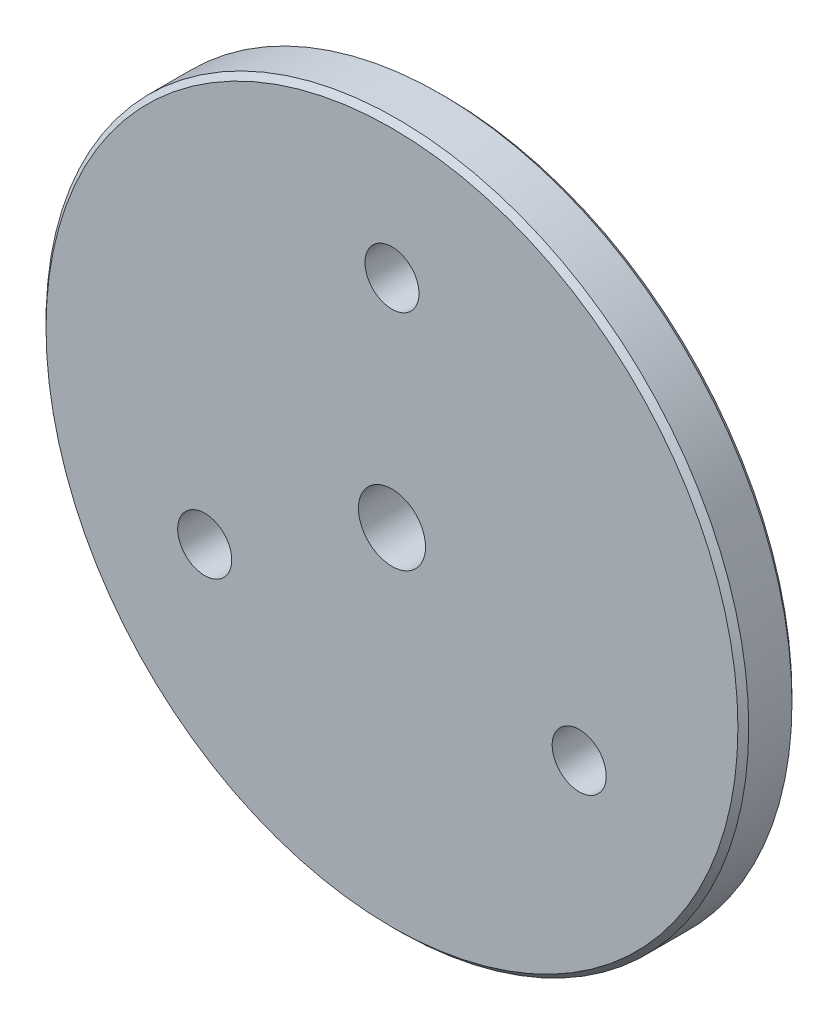
ISO-10303-21;
HEADER;
FILE_DESCRIPTION(('STEP AP214'),'2;1');
FILE_NAME('part.step','',(''),(''),'','','');
FILE_SCHEMA(('AUTOMOTIVE_DESIGN { 1 0 10303 214 1 1 1 1 }'));
ENDSEC;
DATA;
#1=APPLICATION_CONTEXT('core data for automotive mechanical design processes');
#2=APPLICATION_PROTOCOL_DEFINITION('international standard','automotive_design',2000,#1);
#3=PRODUCT_CONTEXT('',#1,'mechanical');
#4=PRODUCT('Part','Part','',(#3));
#5=PRODUCT_RELATED_PRODUCT_CATEGORY('part','',(#4));
#6=PRODUCT_DEFINITION_FORMATION('','',#4);
#7=PRODUCT_DEFINITION_CONTEXT('part definition',#1,'design');
#8=PRODUCT_DEFINITION('design','',#6,#7);
#9=PRODUCT_DEFINITION_SHAPE('','',#8);
#10=(LENGTH_UNIT() NAMED_UNIT(*) SI_UNIT(.MILLI.,.METRE.));
#11=(NAMED_UNIT(*) PLANE_ANGLE_UNIT() SI_UNIT($,.RADIAN.));
#12=(NAMED_UNIT(*) SI_UNIT($,.STERADIAN.) SOLID_ANGLE_UNIT());
#13=UNCERTAINTY_MEASURE_WITH_UNIT(LENGTH_MEASURE(1.E-05),#10,'distance_accuracy_value','');
#14=(GEOMETRIC_REPRESENTATION_CONTEXT(3) GLOBAL_UNCERTAINTY_ASSIGNED_CONTEXT((#13)) GLOBAL_UNIT_ASSIGNED_CONTEXT((#10,
#11,#12)) REPRESENTATION_CONTEXT('',''));
#15=CARTESIAN_POINT('',(0.,0.,0.));
#16=DIRECTION('',(0.,0.,1.));
#17=DIRECTION('',(1.,0.,0.));
#18=AXIS2_PLACEMENT_3D('',#15,#16,#17);
#19=CARTESIAN_POINT('',(0.,0.,5.));
#20=DIRECTION('',(0.,0.,1.));
#21=DIRECTION('',(1.,0.,0.));
#22=AXIS2_PLACEMENT_3D('',#19,#20,#21);
#23=PLANE('',#22);
#24=CARTESIAN_POINT('',(0.,0.,5.));
#25=DIRECTION('',(0.,0.,1.));
#26=DIRECTION('',(1.,0.,0.));
#27=AXIS2_PLACEMENT_3D('',#24,#25,#26);
#28=CIRCLE('',#27,32.);
#29=CARTESIAN_POINT('',(32.,0.,5.));
#30=VERTEX_POINT('',#29);
#31=EDGE_CURVE('E97',#30,#30,#28,.T.);
#32=ORIENTED_EDGE('',*,*,#31,.T.);
#33=EDGE_LOOP('',(#32));
#34=FACE_BOUND('',#33,.T.);
#35=CARTESIAN_POINT('',(0.,0.,5.));
#36=DIRECTION('',(0.,0.,1.));
#37=DIRECTION('',(1.,0.,0.));
#38=AXIS2_PLACEMENT_3D('',#35,#36,#37);
#39=CIRCLE('',#38,3.1);
#40=CARTESIAN_POINT('',(3.1,0.,5.));
#41=VERTEX_POINT('',#40);
#42=EDGE_CURVE('E120',#41,#41,#39,.T.);
#43=ORIENTED_EDGE('',*,*,#42,.F.);
#44=EDGE_LOOP('',(#43));
#45=FACE_BOUND('',#44,.T.);
#46=CARTESIAN_POINT('',(-17.3205080756887,-10.0000000000001,5.));
#47=DIRECTION('',(0.,0.,1.));
#48=DIRECTION('',(1.,0.,0.));
#49=AXIS2_PLACEMENT_3D('',#46,#47,#48);
#50=CIRCLE('',#49,2.5);
#51=CARTESIAN_POINT('',(-14.8205080756887,-10.0000000000001,5.));
#52=VERTEX_POINT('',#51);
#53=EDGE_CURVE('E128',#52,#52,#50,.T.);
#54=ORIENTED_EDGE('',*,*,#53,.F.);
#55=EDGE_LOOP('',(#54));
#56=FACE_BOUND('',#55,.T.);
#57=CARTESIAN_POINT('',(0.,20.,5.));
#58=DIRECTION('',(0.,0.,1.));
#59=DIRECTION('',(1.,0.,0.));
#60=AXIS2_PLACEMENT_3D('',#57,#58,#59);
#61=CIRCLE('',#60,2.5);
#62=CARTESIAN_POINT('',(2.5,20.,5.));
#63=VERTEX_POINT('',#62);
#64=EDGE_CURVE('E138',#63,#63,#61,.T.);
#65=ORIENTED_EDGE('',*,*,#64,.F.);
#66=EDGE_LOOP('',(#65));
#67=FACE_BOUND('',#66,.T.);
#68=CARTESIAN_POINT('',(17.3205080756887,-10.0000000000001,5.));
#69=DIRECTION('',(0.,0.,1.));
#70=DIRECTION('',(1.,0.,0.));
#71=AXIS2_PLACEMENT_3D('',#68,#69,#70);
#72=CIRCLE('',#71,2.5);
#73=CARTESIAN_POINT('',(19.8205080756887,-10.0000000000001,5.));
#74=VERTEX_POINT('',#73);
#75=EDGE_CURVE('E122',#74,#74,#72,.T.);
#76=ORIENTED_EDGE('',*,*,#75,.F.);
#77=EDGE_LOOP('',(#76));
#78=FACE_BOUND('',#77,.T.);
#79=ADVANCED_FACE('F41',(#34,#45,#56,#67,#78),#23,.T.);
#80=CARTESIAN_POINT('',(0.,0.,0.));
#81=DIRECTION('',(0.,0.,1.));
#82=DIRECTION('',(1.,0.,0.));
#83=AXIS2_PLACEMENT_3D('',#80,#81,#82);
#84=PLANE('',#83);
#85=CARTESIAN_POINT('',(0.,0.,0.));
#86=DIRECTION('',(0.,0.,1.));
#87=DIRECTION('',(1.,0.,0.));
#88=AXIS2_PLACEMENT_3D('',#85,#86,#87);
#89=CIRCLE('',#88,32.);
#90=CARTESIAN_POINT('',(32.,0.,0.));
#91=VERTEX_POINT('',#90);
#92=EDGE_CURVE('E106',#91,#91,#89,.F.);
#93=ORIENTED_EDGE('',*,*,#92,.T.);
#94=EDGE_LOOP('',(#93));
#95=FACE_BOUND('',#94,.T.);
#96=DIRECTION('',(-1.,0.,0.));
#97=VECTOR('',#96,1.);
#98=CARTESIAN_POINT('',(0.,6.5,0.));
#99=LINE('',#98,#97);
#100=CARTESIAN_POINT('',(8.24621125123538,6.5,0.));
#101=VERTEX_POINT('',#100);
#102=CARTESIAN_POINT('',(-8.24621125123539,6.5,0.));
#103=VERTEX_POINT('',#102);
#104=EDGE_CURVE('E109',#101,#103,#99,.T.);
#105=ORIENTED_EDGE('',*,*,#104,.T.);
#106=CARTESIAN_POINT('',(0.,0.,0.));
#107=DIRECTION('',(0.,0.,1.));
#108=DIRECTION('',(1.,0.,0.));
#109=AXIS2_PLACEMENT_3D('',#106,#107,#108);
#110=CIRCLE('',#109,10.5);
#111=EDGE_CURVE('E100',#103,#101,#110,.T.);
#112=ORIENTED_EDGE('',*,*,#111,.T.);
#113=EDGE_LOOP('',(#105,#112));
#114=FACE_BOUND('',#113,.T.);
#115=CARTESIAN_POINT('',(0.,20.,0.));
#116=DIRECTION('',(0.,0.,1.));
#117=DIRECTION('',(1.,0.,0.));
#118=AXIS2_PLACEMENT_3D('',#115,#116,#117);
#119=CIRCLE('',#118,2.5);
#120=CARTESIAN_POINT('',(2.5,20.,0.));
#121=VERTEX_POINT('',#120);
#122=EDGE_CURVE('E134',#121,#121,#119,.T.);
#123=ORIENTED_EDGE('',*,*,#122,.T.);
#124=EDGE_LOOP('',(#123));
#125=FACE_BOUND('',#124,.T.);
#126=CARTESIAN_POINT('',(-17.3205080756887,-10.0000000000001,0.));
#127=DIRECTION('',(0.,0.,1.));
#128=DIRECTION('',(1.,0.,0.));
#129=AXIS2_PLACEMENT_3D('',#126,#127,#128);
#130=CIRCLE('',#129,2.5);
#131=CARTESIAN_POINT('',(-14.8205080756887,-10.0000000000001,0.));
#132=VERTEX_POINT('',#131);
#133=EDGE_CURVE('E130',#132,#132,#130,.T.);
#134=ORIENTED_EDGE('',*,*,#133,.T.);
#135=EDGE_LOOP('',(#134));
#136=FACE_BOUND('',#135,.T.);
#137=CARTESIAN_POINT('',(17.3205080756887,-10.0000000000001,0.));
#138=DIRECTION('',(0.,0.,1.));
#139=DIRECTION('',(1.,0.,0.));
#140=AXIS2_PLACEMENT_3D('',#137,#138,#139);
#141=CIRCLE('',#140,2.5);
#142=CARTESIAN_POINT('',(19.8205080756887,-10.0000000000001,0.));
#143=VERTEX_POINT('',#142);
#144=EDGE_CURVE('E121',#143,#143,#141,.T.);
#145=ORIENTED_EDGE('',*,*,#144,.T.);
#146=EDGE_LOOP('',(#145));
#147=FACE_BOUND('',#146,.T.);
#148=ADVANCED_FACE('F193',(#95,#114,#125,#136,#147),#84,.F.);
#149=CARTESIAN_POINT('',(0.,0.,5.));
#150=DIRECTION('',(0.,0.,-1.));
#151=DIRECTION('',(-1.,0.,0.));
#152=AXIS2_PLACEMENT_3D('',#149,#150,#151);
#153=CYLINDRICAL_SURFACE('',#152,32.5);
#154=CARTESIAN_POINT('',(0.,0.,0.49999999999998));
#155=DIRECTION('',(0.,0.,1.));
#156=DIRECTION('',(1.,0.,0.));
#157=AXIS2_PLACEMENT_3D('',#154,#155,#156);
#158=CIRCLE('',#157,32.5);
#159=CARTESIAN_POINT('',(32.5,0.,0.49999999999998));
#160=VERTEX_POINT('',#159);
#161=EDGE_CURVE('E251',#160,#160,#158,.T.);
#162=ORIENTED_EDGE('',*,*,#161,.T.);
#163=EDGE_LOOP('',(#162));
#164=FACE_BOUND('',#163,.T.);
#165=CARTESIAN_POINT('',(0.,0.,4.5));
#166=DIRECTION('',(0.,0.,1.));
#167=DIRECTION('',(1.,0.,0.));
#168=AXIS2_PLACEMENT_3D('',#165,#166,#167);
#169=CIRCLE('',#168,32.5);
#170=CARTESIAN_POINT('',(32.5,0.,4.5));
#171=VERTEX_POINT('',#170);
#172=EDGE_CURVE('E255',#171,#171,#169,.F.);
#173=ORIENTED_EDGE('',*,*,#172,.T.);
#174=EDGE_LOOP('',(#173));
#175=FACE_BOUND('',#174,.T.);
#176=ADVANCED_FACE('F186',(#164,#175),#153,.T.);
#177=CARTESIAN_POINT('',(0.,20.,5.));
#178=DIRECTION('',(0.,0.,-1.));
#179=DIRECTION('',(-1.,0.,0.));
#180=AXIS2_PLACEMENT_3D('',#177,#178,#179);
#181=CYLINDRICAL_SURFACE('',#180,2.5);
#182=ORIENTED_EDGE('',*,*,#64,.T.);
#183=EDGE_LOOP('',(#182));
#184=FACE_BOUND('',#183,.T.);
#185=ORIENTED_EDGE('',*,*,#122,.F.);
#186=EDGE_LOOP('',(#185));
#187=FACE_BOUND('',#186,.T.);
#188=ADVANCED_FACE('F190',(#184,#187),#181,.F.);
#189=CARTESIAN_POINT('',(-17.3205080756887,-10.0000000000001,5.));
#190=DIRECTION('',(0.,0.,-1.));
#191=DIRECTION('',(-1.,0.,0.));
#192=AXIS2_PLACEMENT_3D('',#189,#190,#191);
#193=CYLINDRICAL_SURFACE('',#192,2.5);
#194=ORIENTED_EDGE('',*,*,#53,.T.);
#195=EDGE_LOOP('',(#194));
#196=FACE_BOUND('',#195,.T.);
#197=ORIENTED_EDGE('',*,*,#133,.F.);
#198=EDGE_LOOP('',(#197));
#199=FACE_BOUND('',#198,.T.);
#200=ADVANCED_FACE('F203',(#196,#199),#193,.F.);
#201=CARTESIAN_POINT('',(17.3205080756887,-10.0000000000001,5.));
#202=DIRECTION('',(0.,0.,-1.));
#203=DIRECTION('',(-1.,0.,0.));
#204=AXIS2_PLACEMENT_3D('',#201,#202,#203);
#205=CYLINDRICAL_SURFACE('',#204,2.5);
#206=ORIENTED_EDGE('',*,*,#75,.T.);
#207=EDGE_LOOP('',(#206));
#208=FACE_BOUND('',#207,.T.);
#209=ORIENTED_EDGE('',*,*,#144,.F.);
#210=EDGE_LOOP('',(#209));
#211=FACE_BOUND('',#210,.T.);
#212=ADVANCED_FACE('F202',(#208,#211),#205,.F.);
#213=CARTESIAN_POINT('',(0.,0.,-14.5));
#214=DIRECTION('',(0.,0.,1.));
#215=DIRECTION('',(1.,0.,0.));
#216=AXIS2_PLACEMENT_3D('',#213,#214,#215);
#217=CYLINDRICAL_SURFACE('',#216,10.);
#218=DIRECTION('',(0.,0.,-1.));
#219=VECTOR('',#218,1.);
#220=CARTESIAN_POINT('',(7.59934207678533,6.5,0.));
#221=LINE('',#220,#219);
#222=CARTESIAN_POINT('',(7.59934207678533,6.5,-0.500000000000056));
#223=VERTEX_POINT('',#222);
#224=CARTESIAN_POINT('',(7.59934207678533,6.5,-14.));
#225=VERTEX_POINT('',#224);
#226=EDGE_CURVE('E104',#223,#225,#221,.T.);
#227=ORIENTED_EDGE('',*,*,#226,.F.);
#228=CARTESIAN_POINT('',(0.,0.,-0.500000000000056));
#229=DIRECTION('',(0.,0.,1.));
#230=DIRECTION('',(1.,0.,0.));
#231=AXIS2_PLACEMENT_3D('',#228,#229,#230);
#232=CIRCLE('',#231,10.);
#233=CARTESIAN_POINT('',(-7.59934207678533,6.5,-0.500000000000056));
#234=VERTEX_POINT('',#233);
#235=EDGE_CURVE('E92',#223,#234,#232,.F.);
#236=ORIENTED_EDGE('',*,*,#235,.T.);
#237=DIRECTION('',(0.,0.,-1.));
#238=VECTOR('',#237,1.);
#239=CARTESIAN_POINT('',(-7.59934207678533,6.5,0.));
#240=LINE('',#239,#238);
#241=CARTESIAN_POINT('',(-7.59934207678533,6.5,-14.));
#242=VERTEX_POINT('',#241);
#243=EDGE_CURVE('E102',#234,#242,#240,.T.);
#244=ORIENTED_EDGE('',*,*,#243,.T.);
#245=CARTESIAN_POINT('',(0.,0.,-14.));
#246=DIRECTION('',(0.,0.,-1.));
#247=DIRECTION('',(-1.,0.,0.));
#248=AXIS2_PLACEMENT_3D('',#245,#246,#247);
#249=CIRCLE('',#248,10.);
#250=EDGE_CURVE('E110',#242,#225,#249,.F.);
#251=ORIENTED_EDGE('',*,*,#250,.T.);
#252=EDGE_LOOP('',(#227,#236,#244,#251));
#253=FACE_BOUND('',#252,.T.);
#254=ADVANCED_FACE('F103',(#253),#217,.T.);
#255=CARTESIAN_POINT('',(0.,0.,-14.5));
#256=DIRECTION('',(0.,0.,-1.));
#257=DIRECTION('',(-1.,0.,0.));
#258=AXIS2_PLACEMENT_3D('',#255,#256,#257);
#259=PLANE('',#258);
#260=DIRECTION('',(-1.,0.,0.));
#261=VECTOR('',#260,1.);
#262=CARTESIAN_POINT('',(0.,6.5,-14.5));
#263=LINE('',#262,#261);
#264=CARTESIAN_POINT('',(6.92820323027555,6.5,-14.5));
#265=VERTEX_POINT('',#264);
#266=CARTESIAN_POINT('',(-6.92820323027555,6.5,-14.5));
#267=VERTEX_POINT('',#266);
#268=EDGE_CURVE('E111',#265,#267,#263,.T.);
#269=ORIENTED_EDGE('',*,*,#268,.F.);
#270=CARTESIAN_POINT('',(0.,0.,-14.5));
#271=DIRECTION('',(0.,0.,-1.));
#272=DIRECTION('',(-1.,0.,0.));
#273=AXIS2_PLACEMENT_3D('',#270,#271,#272);
#274=CIRCLE('',#273,9.50000000000003);
#275=EDGE_CURVE('E144',#265,#267,#274,.T.);
#276=ORIENTED_EDGE('',*,*,#275,.T.);
#277=EDGE_LOOP('',(#269,#276));
#278=FACE_BOUND('',#277,.T.);
#279=CARTESIAN_POINT('',(0.,0.,-14.5));
#280=DIRECTION('',(0.,0.,-1.));
#281=DIRECTION('',(-1.,0.,0.));
#282=AXIS2_PLACEMENT_3D('',#279,#280,#281);
#283=CIRCLE('',#282,3.1);
#284=CARTESIAN_POINT('',(-3.1,0.,-14.5));
#285=VERTEX_POINT('',#284);
#286=EDGE_CURVE('E115',#285,#285,#283,.T.);
#287=ORIENTED_EDGE('',*,*,#286,.F.);
#288=EDGE_LOOP('',(#287));
#289=FACE_BOUND('',#288,.T.);
#290=ADVANCED_FACE('F211',(#278,#289),#259,.T.);
#291=CARTESIAN_POINT('',(0.,0.,10.));
#292=DIRECTION('',(0.,0.,-1.));
#293=DIRECTION('',(-1.,0.,0.));
#294=AXIS2_PLACEMENT_3D('',#291,#292,#293);
#295=CYLINDRICAL_SURFACE('',#294,3.1);
#296=CARTESIAN_POINT('',(-1.5,2.71293199325011,-7.25));
#297=CARTESIAN_POINT('',(-1.49999492059757,2.71293810602707,-7.17145338095106));
#298=CARTESIAN_POINT('',(-1.49378977985908,2.71639437877482,-7.09279890208662));
#299=CARTESIAN_POINT('',(-1.46927137742174,2.72972979584767,-6.93787319036452));
#300=CARTESIAN_POINT('',(-1.45093105142698,2.73962329586937,-6.86160768457514));
#301=CARTESIAN_POINT('',(-1.4030976209863,2.76442252776009,-6.71398954425589));
#302=CARTESIAN_POINT('',(-1.37366086619922,2.7793028937549,-6.64261420542806));
#303=CARTESIAN_POINT('',(-1.30464150179683,2.81236022577533,-6.50583245638499));
#304=CARTESIAN_POINT('',(-1.2650589136927,2.83053718481149,-6.44042603351486));
#305=CARTESIAN_POINT('',(-1.17329480013247,2.86985264094388,-6.31187111011291));
#306=CARTESIAN_POINT('',(-1.12037798569234,2.89111140167801,-6.24928399126661));
#307=CARTESIAN_POINT('',(-1.00497971934906,2.93322157526014,-6.13344072464569));
#308=CARTESIAN_POINT('',(-0.94249377317567,2.95407279148337,-6.08018898669397));
#309=CARTESIAN_POINT('',(-0.804980520744671,2.99457001608098,-5.98129528716694));
#310=CARTESIAN_POINT('',(-0.729415143076343,3.01406059193925,-5.93633192135187));
#311=CARTESIAN_POINT('',(-0.570673893121411,3.04809814226509,-5.86000972137905));
#312=CARTESIAN_POINT('',(-0.487502560865868,3.06264804171259,-5.82864283477935));
#313=CARTESIAN_POINT('',(-0.321847709467146,3.08430127904169,-5.78258786508132));
#314=CARTESIAN_POINT('',(-0.239695127397447,3.09184014117435,-5.76691875227797));
#315=CARTESIAN_POINT('',(-0.0736068203923179,3.10023882355099,-5.7494857824594));
#316=CARTESIAN_POINT('',(0.0103278765621595,3.10110239470556,-5.74771411632615));
#317=CARTESIAN_POINT('',(0.170273249700909,3.09627020423456,-5.75771943077071));
#318=CARTESIAN_POINT('',(0.246371834339656,3.09110371985573,-5.76840308096274));
#319=CARTESIAN_POINT('',(0.395538468369623,3.07557700513506,-5.80107628892171));
#320=CARTESIAN_POINT('',(0.46860629156116,3.06521638788366,-5.82306668892852));
#321=CARTESIAN_POINT('',(0.61095110434779,3.04007288157933,-5.87790542061429));
#322=CARTESIAN_POINT('',(0.68015806569427,3.02522825824131,-5.91090604729296));
#323=CARTESIAN_POINT('',(0.812225689942344,2.99247817620383,-5.98663535937203));
#324=CARTESIAN_POINT('',(0.875084030725964,2.97457160394644,-6.02936758580624));
#325=CARTESIAN_POINT('',(0.998700620360538,2.9355013363418,-6.12777575195723));
#326=CARTESIAN_POINT('',(1.05876095216352,2.91418954377451,-6.18427039936896));
#327=CARTESIAN_POINT('',(1.16891768527134,2.87178037530514,-6.30638943634393));
#328=CARTESIAN_POINT('',(1.21900726107665,2.8506831556003,-6.37202002806386));
#329=CARTESIAN_POINT('',(1.31055794759544,2.80982104768052,-6.51511878591444));
#330=CARTESIAN_POINT('',(1.35137051946412,2.79019907829767,-6.59304661554537));
#331=CARTESIAN_POINT('',(1.41899941443367,2.75642605801252,-6.75584502162601));
#332=CARTESIAN_POINT('',(1.44582953272961,2.74226961836549,-6.84070865913566));
#333=CARTESIAN_POINT('',(1.48263666296822,2.72253482573975,-7.00803599203581));
#334=CARTESIAN_POINT('',(1.49375661147253,2.71637771942639,-7.09017768831628));
#335=CARTESIAN_POINT('',(1.50226461760217,2.71168425392407,-7.2553658221273));
#336=CARTESIAN_POINT('',(1.49966105190683,2.71314324594875,-7.33841167688108));
#337=CARTESIAN_POINT('',(1.48184467777125,2.72290566354281,-7.49428652430767));
#338=CARTESIAN_POINT('',(1.4679086290649,2.73051559969672,-7.56731166122939));
#339=CARTESIAN_POINT('',(1.42967569872823,2.75072559786317,-7.70986596646282));
#340=CARTESIAN_POINT('',(1.40537571111578,2.76332715574048,-7.77939407975822));
#341=CARTESIAN_POINT('',(1.34590177267689,2.7927932466317,-7.91663435328626));
#342=CARTESIAN_POINT('',(1.31027553001639,2.80982847144386,-7.98411250751696));
#343=CARTESIAN_POINT('',(1.2295640127949,2.84607243783817,-8.11251365491914));
#344=CARTESIAN_POINT('',(1.18447394453352,2.86528227864574,-8.17343330226763));
#345=CARTESIAN_POINT('',(1.07996442995556,2.90640342115472,-8.2944070687536));
#346=CARTESIAN_POINT('',(1.01948756982411,2.92836871534928,-8.35353347827957));
#347=CARTESIAN_POINT('',(0.88908160181107,2.97056031612546,-8.46106448188801));
#348=CARTESIAN_POINT('',(0.819149930698388,2.99078614869189,-8.50946615903666));
#349=CARTESIAN_POINT('',(0.669801398703178,3.02777065360343,-8.59495828363942));
#350=CARTESIAN_POINT('',(0.59022068807768,3.04445053122811,-8.63179893043581));
#351=CARTESIAN_POINT('',(0.424953967870416,3.07187356547455,-8.69121726559231));
#352=CARTESIAN_POINT('',(0.339273042215535,3.08262160180212,-8.71380667962851));
#353=CARTESIAN_POINT('',(0.172367739972272,3.09623602551114,-8.74225209879286));
#354=CARTESIAN_POINT('',(0.0914132929018972,3.099711970682,-8.7494040192855));
#355=CARTESIAN_POINT('',(-0.0705970615455855,3.10025308480682,-8.75052376117435));
#356=CARTESIAN_POINT('',(-0.151652930195124,3.0973202193951,-8.74449562500078));
#357=CARTESIAN_POINT('',(-0.306535872374834,3.08572788901491,-8.72031211351025));
#358=CARTESIAN_POINT('',(-0.380506967606488,3.07741733526782,-8.70289498936343));
#359=CARTESIAN_POINT('',(-0.524375894010132,3.05619391816196,-8.65738244607744));
#360=CARTESIAN_POINT('',(-0.594273102164777,3.04328035300466,-8.62928539857947));
#361=CARTESIAN_POINT('',(-0.73147253663464,3.01332001683357,-8.56188714990095));
#362=CARTESIAN_POINT('',(-0.798522504117893,2.9961154438214,-8.52214461741312));
#363=CARTESIAN_POINT('',(-0.925289323220526,2.95942590784809,-8.43315023034412));
#364=CARTESIAN_POINT('',(-0.98500278506389,2.93993989882688,-8.38389400686762));
#365=CARTESIAN_POINT('',(-1.10128775860753,2.89850357205403,-8.27189911041141));
#366=CARTESIAN_POINT('',(-1.15704001821865,2.87649347823812,-8.20832941264973));
#367=CARTESIAN_POINT('',(-1.25735148728903,2.83408562289402,-8.0723203729531));
#368=CARTESIAN_POINT('',(-1.30190182818343,2.81368914756881,-7.99987407046686));
#369=CARTESIAN_POINT('',(-1.37929552477,2.77658650994691,-7.84592842756558));
#370=CARTESIAN_POINT('',(-1.41185622470861,2.7599725949942,-7.76426347135833));
#371=CARTESIAN_POINT('',(-1.4622728069576,2.73360384914068,-7.59561013328523));
#372=CARTESIAN_POINT('',(-1.48017802084133,2.72382602374533,-7.50864067808893));
#373=CARTESIAN_POINT('',(-1.49350264095651,2.7165154455489,-7.3923641457717));
#374=CARTESIAN_POINT('',(-1.49593586787793,2.71517570481292,-7.36396777457064));
#375=CARTESIAN_POINT('',(-1.4991855180506,2.71338284202488,-7.3070523515063));
#376=CARTESIAN_POINT('',(-1.50000184517267,2.71292977268791,-7.2785332924499));
#377=CARTESIAN_POINT('',(-1.5,2.71293199325011,-7.25));
#378=B_SPLINE_CURVE_WITH_KNOTS('',3,(#296,#297,#298,#299,#300,#301,#302,#303,#304,#305,#306,
#307,#308,#309,#310,#311,#312,#313,#314,#315,#316,#317,#318,#319,#320,#321,#322,#323,#324,#325,
#326,#327,#328,#329,#330,#331,#332,#333,#334,#335,#336,#337,#338,#339,#340,#341,#342,#343,#344,
#345,#346,#347,#348,#349,#350,#351,#352,#353,#354,#355,#356,#357,#358,#359,#360,#361,#362,#363,
#364,#365,#366,#367,#368,#369,#370,#371,#372,#373,#374,#375,#376,#377),.UNSPECIFIED.,.T.,.F.,(4,
2,2,2,2,2,2,2,2,2,2,2,2,2,2,2,2,2,2,2,2,2,2,2,2,2,2,2,2,2,2,2,2,2,2,2,2,2,2,2,4),(0.,
0.235519909494817,0.471566861867467,0.706430929695081,0.941294499568247,1.19423736348461,
1.4472993918053,1.7160884568173,1.98471811471995,2.2352557120008,2.48565251954048,
2.71562530273618,2.94561521908867,3.17892825434238,3.41232632115821,3.66672597203251,
3.92129917825519,4.19027593547097,4.45898681336751,4.70691557051381,4.95469301225538,
5.1778852290003,5.4011443815597,5.63476423123155,5.86850270291336,6.12947262056348,
6.39051343043701,6.65685802537525,6.92298318964467,7.16572463042056,7.40839163087321,
7.6367080116984,7.86505921769989,8.10352972246075,8.34210999959677,8.60305499644809,
8.86420593768663,9.13116977898829,9.39723125898446,9.48278247736157,9.56833878184367),.UNSPECIFIED.);
#379=CARTESIAN_POINT('',(-1.5,2.71293199325011,-7.25));
#380=VERTEX_POINT('',#379);
#381=EDGE_CURVE('E222',#380,#380,#378,.T.);
#382=ORIENTED_EDGE('',*,*,#381,.T.);
#383=EDGE_LOOP('',(#382));
#384=FACE_BOUND('',#383,.T.);
#385=ORIENTED_EDGE('',*,*,#42,.T.);
#386=EDGE_LOOP('',(#385));
#387=FACE_BOUND('',#386,.T.);
#388=ORIENTED_EDGE('',*,*,#286,.T.);
#389=EDGE_LOOP('',(#388));
#390=FACE_BOUND('',#389,.T.);
#391=ADVANCED_FACE('F167',(#384,#387,#390),#295,.F.);
#392=CARTESIAN_POINT('',(0.,6.5,0.));
#393=DIRECTION('',(0.,-1.,0.));
#394=DIRECTION('',(1.,0.,0.));
#395=AXIS2_PLACEMENT_3D('',#392,#393,#394);
#396=PLANE('',#395);
#397=CARTESIAN_POINT('',(0.,6.5,-7.25));
#398=DIRECTION('',(0.,1.,0.));
#399=DIRECTION('',(-1.,0.,0.));
#400=AXIS2_PLACEMENT_3D('',#397,#398,#399);
#401=CIRCLE('',#400,1.5);
#402=CARTESIAN_POINT('',(-1.5,6.5,-7.25));
#403=VERTEX_POINT('',#402);
#404=EDGE_CURVE('E364',#403,#403,#401,.T.);
#405=ORIENTED_EDGE('',*,*,#404,.F.);
#406=EDGE_LOOP('',(#405));
#407=FACE_BOUND('',#406,.T.);
#408=ORIENTED_EDGE('',*,*,#268,.T.);
#409=CARTESIAN_POINT('',(-6.92820323027555,6.5,-14.5));
#410=CARTESIAN_POINT('',(-6.98455447883931,6.5,-14.4589036659588));
#411=CARTESIAN_POINT('',(-7.04079412939878,6.5,-14.4176544757209));
#412=CARTESIAN_POINT('',(-7.15305799361525,6.5,-14.3348667779703));
#413=CARTESIAN_POINT('',(-7.20908221246546,6.5,-14.2933282775004));
#414=CARTESIAN_POINT('',(-7.32092560245471,6.5,-14.2099764358199));
#415=CARTESIAN_POINT('',(-7.37674477397159,6.5,-14.168163095116));
#416=CARTESIAN_POINT('',(-7.488187994632,6.5,-14.0842743663134));
#417=CARTESIAN_POINT('',(-7.54381203900934,6.5,-14.0421989718825));
#418=CARTESIAN_POINT('',(-7.59934207678533,6.5,-14.));
#419=B_SPLINE_CURVE_WITH_KNOTS('',3,(#409,#410,#411,#412,#413,#414,#415,#416,#417,#418),
.UNSPECIFIED.,.F.,.F.,(4,2,2,2,4),(0.,0.209234749172276,0.418464422485313,0.627693710061944,
0.836928073199901),.UNSPECIFIED.);
#420=EDGE_CURVE('E64',#267,#242,#419,.T.);
#421=ORIENTED_EDGE('',*,*,#420,.T.);
#422=ORIENTED_EDGE('',*,*,#243,.F.);
#423=CARTESIAN_POINT('',(-7.59934207678533,6.5,-0.500000000000056));
#424=CARTESIAN_POINT('',(-7.70781627676448,6.5,-0.41752390350744));
#425=CARTESIAN_POINT('',(-7.81595916195015,6.5,-0.334619172362294));
#426=CARTESIAN_POINT('',(-8.03158221958914,6.5,-0.167952505034474));
#427=CARTESIAN_POINT('',(-8.13906239255349,6.5,-0.0841905695129349));
#428=CARTESIAN_POINT('',(-8.24621125123539,6.5,0.));
#429=B_SPLINE_CURVE_WITH_KNOTS('',3,(#423,#424,#425,#426,#427,#428),.UNSPECIFIED.,.F.,.F.,(4,2,
4),(0.,0.408794205637459,0.817588096008699),.UNSPECIFIED.);
#430=EDGE_CURVE('E57',#234,#103,#429,.T.);
#431=ORIENTED_EDGE('',*,*,#430,.T.);
#432=ORIENTED_EDGE('',*,*,#104,.F.);
#433=CARTESIAN_POINT('',(8.24621125123538,6.5,0.));
#434=CARTESIAN_POINT('',(8.13906239255349,6.5,-0.0841905695129371));
#435=CARTESIAN_POINT('',(8.03158221958914,6.5,-0.167952505034477));
#436=CARTESIAN_POINT('',(7.81595916195015,6.5,-0.334619172362297));
#437=CARTESIAN_POINT('',(7.70781627676448,6.5,-0.417523903507442));
#438=CARTESIAN_POINT('',(7.59934207678533,6.5,-0.500000000000056));
#439=B_SPLINE_CURVE_WITH_KNOTS('',3,(#433,#434,#435,#436,#437,#438),.UNSPECIFIED.,.F.,.F.,(4,2,
4),(0.,0.408793890371239,0.817588096008696),.UNSPECIFIED.);
#440=EDGE_CURVE('E11',#101,#223,#439,.T.);
#441=ORIENTED_EDGE('',*,*,#440,.T.);
#442=ORIENTED_EDGE('',*,*,#226,.T.);
#443=CARTESIAN_POINT('',(7.59934207678533,6.5,-14.));
#444=CARTESIAN_POINT('',(7.54381203900934,6.5,-14.0421989718825));
#445=CARTESIAN_POINT('',(7.488187994632,6.5,-14.0842743663135));
#446=CARTESIAN_POINT('',(7.37674477397159,6.5,-14.168163095116));
#447=CARTESIAN_POINT('',(7.32092560245471,6.5,-14.2099764358199));
#448=CARTESIAN_POINT('',(7.20908221246546,6.5,-14.2933282775004));
#449=CARTESIAN_POINT('',(7.15305799361525,6.5,-14.3348667779703));
#450=CARTESIAN_POINT('',(7.04079412939879,6.5,-14.4176544757209));
#451=CARTESIAN_POINT('',(6.98455447883931,6.5,-14.4589036659588));
#452=CARTESIAN_POINT('',(6.92820323027556,6.5,-14.5));
#453=B_SPLINE_CURVE_WITH_KNOTS('',3,(#443,#444,#445,#446,#447,#448,#449,#450,#451,#452),
.UNSPECIFIED.,.F.,.F.,(4,2,2,2,4),(0.,0.209234363137959,0.418463650714589,0.627693324027624,
0.836928073199899),.UNSPECIFIED.);
#454=EDGE_CURVE('E72',#225,#265,#453,.T.);
#455=ORIENTED_EDGE('',*,*,#454,.T.);
#456=EDGE_LOOP('',(#408,#421,#422,#431,#432,#441,#442,#455));
#457=FACE_BOUND('',#456,.T.);
#458=ADVANCED_FACE('F108',(#407,#457),#396,.F.);
#459=CARTESIAN_POINT('',(0.,1.5,-7.25));
#460=DIRECTION('',(0.,1.,0.));
#461=DIRECTION('',(-1.,0.,0.));
#462=AXIS2_PLACEMENT_3D('',#459,#460,#461);
#463=CYLINDRICAL_SURFACE('',#462,1.5);
#464=ORIENTED_EDGE('',*,*,#404,.T.);
#465=EDGE_LOOP('',(#464));
#466=FACE_BOUND('',#465,.T.);
#467=ORIENTED_EDGE('',*,*,#381,.F.);
#468=EDGE_LOOP('',(#467));
#469=FACE_BOUND('',#468,.T.);
#470=ADVANCED_FACE('F164',(#466,#469),#463,.F.);
#471=CARTESIAN_POINT('',(0.,0.,-0.500000000000056));
#472=DIRECTION('',(0.,0.,1.));
#473=DIRECTION('',(1.,0.,0.));
#474=AXIS2_PLACEMENT_3D('',#471,#472,#473);
#475=CONICAL_SURFACE('',#474,10.,0.785398163397441);
#476=ORIENTED_EDGE('',*,*,#440,.F.);
#477=ORIENTED_EDGE('',*,*,#111,.F.);
#478=ORIENTED_EDGE('',*,*,#430,.F.);
#479=ORIENTED_EDGE('',*,*,#235,.F.);
#480=EDGE_LOOP('',(#476,#477,#478,#479));
#481=FACE_BOUND('',#480,.T.);
#482=ADVANCED_FACE('F94',(#481),#475,.T.);
#483=CARTESIAN_POINT('',(0.,0.,-14.5));
#484=DIRECTION('',(0.,0.,1.));
#485=DIRECTION('',(1.,0.,0.));
#486=AXIS2_PLACEMENT_3D('',#483,#484,#485);
#487=CONICAL_SURFACE('',#486,9.50000000000003,0.785398163397455);
#488=ORIENTED_EDGE('',*,*,#454,.F.);
#489=ORIENTED_EDGE('',*,*,#250,.F.);
#490=ORIENTED_EDGE('',*,*,#420,.F.);
#491=ORIENTED_EDGE('',*,*,#275,.F.);
#492=EDGE_LOOP('',(#488,#489,#490,#491));
#493=FACE_BOUND('',#492,.T.);
#494=ADVANCED_FACE('F157',(#493),#487,.T.);
#495=CARTESIAN_POINT('',(0.,0.,0.49999999999998));
#496=DIRECTION('',(0.,0.,1.));
#497=DIRECTION('',(1.,0.,0.));
#498=AXIS2_PLACEMENT_3D('',#495,#496,#497);
#499=CONICAL_SURFACE('',#498,32.5,0.785398163397455);
#500=ORIENTED_EDGE('',*,*,#92,.F.);
#501=EDGE_LOOP('',(#500));
#502=FACE_BOUND('',#501,.T.);
#503=ORIENTED_EDGE('',*,*,#161,.F.);
#504=EDGE_LOOP('',(#503));
#505=FACE_BOUND('',#504,.T.);
#506=ADVANCED_FACE('F231',(#502,#505),#499,.T.);
#507=CARTESIAN_POINT('',(0.,0.,5.));
#508=DIRECTION('',(0.,0.,-1.));
#509=DIRECTION('',(-1.,0.,0.));
#510=AXIS2_PLACEMENT_3D('',#507,#508,#509);
#511=CONICAL_SURFACE('',#510,32.,0.785398163397435);
#512=ORIENTED_EDGE('',*,*,#172,.F.);
#513=EDGE_LOOP('',(#512));
#514=FACE_BOUND('',#513,.T.);
#515=ORIENTED_EDGE('',*,*,#31,.F.);
#516=EDGE_LOOP('',(#515));
#517=FACE_BOUND('',#516,.T.);
#518=ADVANCED_FACE('F42',(#514,#517),#511,.T.);
#519=CLOSED_SHELL('',(#79,#148,#176,#188,#200,#212,#254,#290,#391,#458,#470,#482,#494,#506,#518));
#520=MANIFOLD_SOLID_BREP('B2',#519);
#521=ADVANCED_BREP_SHAPE_REPRESENTATION('',(#18,#520),#14);
#522=SHAPE_DEFINITION_REPRESENTATION(#9,#521);
ENDSEC;
END-ISO-10303-21;
